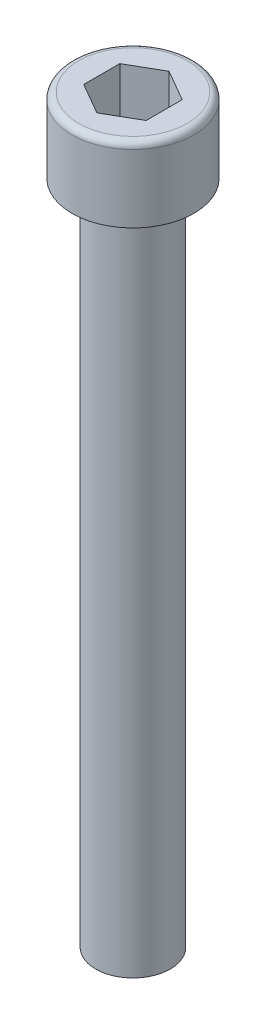
ISO-10303-21;
HEADER;
FILE_DESCRIPTION(('STEP AP214'),'2;1');
FILE_NAME('part.step','',(''),(''),'','','');
FILE_SCHEMA(('AUTOMOTIVE_DESIGN { 1 0 10303 214 1 1 1 1 }'));
ENDSEC;
DATA;
#1=APPLICATION_CONTEXT('core data for automotive mechanical design processes');
#2=APPLICATION_PROTOCOL_DEFINITION('international standard','automotive_design',2000,#1);
#3=PRODUCT_CONTEXT('',#1,'mechanical');
#4=PRODUCT('Part','Part','',(#3));
#5=PRODUCT_RELATED_PRODUCT_CATEGORY('part','',(#4));
#6=PRODUCT_DEFINITION_FORMATION('','',#4);
#7=PRODUCT_DEFINITION_CONTEXT('part definition',#1,'design');
#8=PRODUCT_DEFINITION('design','',#6,#7);
#9=PRODUCT_DEFINITION_SHAPE('','',#8);
#10=(LENGTH_UNIT() NAMED_UNIT(*) SI_UNIT(.MILLI.,.METRE.));
#11=(NAMED_UNIT(*) PLANE_ANGLE_UNIT() SI_UNIT($,.RADIAN.));
#12=(NAMED_UNIT(*) SI_UNIT($,.STERADIAN.) SOLID_ANGLE_UNIT());
#13=UNCERTAINTY_MEASURE_WITH_UNIT(LENGTH_MEASURE(1.E-05),#10,'distance_accuracy_value','');
#14=(GEOMETRIC_REPRESENTATION_CONTEXT(3) GLOBAL_UNCERTAINTY_ASSIGNED_CONTEXT((#13)) GLOBAL_UNIT_ASSIGNED_CONTEXT((#10,
#11,#12)) REPRESENTATION_CONTEXT('',''));
#15=CARTESIAN_POINT('',(0.,0.,0.));
#16=DIRECTION('',(0.,0.,1.));
#17=DIRECTION('',(1.,0.,0.));
#18=AXIS2_PLACEMENT_3D('',#15,#16,#17);
#19=CARTESIAN_POINT('',(0.,-25.4,0.));
#20=DIRECTION('',(0.,1.,0.));
#21=DIRECTION('',(0.,0.,1.));
#22=AXIS2_PLACEMENT_3D('',#19,#20,#21);
#23=CYLINDRICAL_SURFACE('',#22,1.4224);
#24=CARTESIAN_POINT('',(0.,-25.4,0.));
#25=DIRECTION('',(0.,1.,0.));
#26=DIRECTION('',(0.,0.,1.));
#27=AXIS2_PLACEMENT_3D('',#24,#25,#26);
#28=CIRCLE('',#27,1.4224);
#29=CARTESIAN_POINT('',(0.,-25.4,1.4224));
#30=VERTEX_POINT('',#29);
#31=EDGE_CURVE('E145',#30,#30,#28,.T.);
#32=ORIENTED_EDGE('',*,*,#31,.T.);
#33=EDGE_LOOP('',(#32));
#34=FACE_BOUND('',#33,.T.);
#35=CARTESIAN_POINT('',(0.,0.,0.));
#36=DIRECTION('',(0.,1.,0.));
#37=DIRECTION('',(0.,0.,1.));
#38=AXIS2_PLACEMENT_3D('',#35,#36,#37);
#39=CIRCLE('',#38,1.4224);
#40=CARTESIAN_POINT('',(0.,0.,1.4224));
#41=VERTEX_POINT('',#40);
#42=EDGE_CURVE('E144',#41,#41,#39,.T.);
#43=ORIENTED_EDGE('',*,*,#42,.F.);
#44=EDGE_LOOP('',(#43));
#45=FACE_BOUND('',#44,.T.);
#46=ADVANCED_FACE('F34',(#34,#45),#23,.T.);
#47=CARTESIAN_POINT('',(0.,-25.4,0.));
#48=DIRECTION('',(0.,1.,0.));
#49=DIRECTION('',(0.,0.,1.));
#50=AXIS2_PLACEMENT_3D('',#47,#48,#49);
#51=PLANE('',#50);
#52=ORIENTED_EDGE('',*,*,#31,.F.);
#53=EDGE_LOOP('',(#52));
#54=FACE_BOUND('',#53,.T.);
#55=ADVANCED_FACE('F168',(#54),#51,.F.);
#56=CARTESIAN_POINT('',(0.,2.8448,0.));
#57=DIRECTION('',(0.,-1.,0.));
#58=DIRECTION('',(0.,0.,-1.));
#59=AXIS2_PLACEMENT_3D('',#56,#57,#58);
#60=CYLINDRICAL_SURFACE('',#59,2.3241);
#61=CARTESIAN_POINT('',(0.,2.5908,0.));
#62=DIRECTION('',(0.,1.,0.));
#63=DIRECTION('',(0.,0.,1.));
#64=AXIS2_PLACEMENT_3D('',#61,#62,#63);
#65=CIRCLE('',#64,2.3241);
#66=CARTESIAN_POINT('',(0.,2.5908,2.3241));
#67=VERTEX_POINT('',#66);
#68=EDGE_CURVE('E11',#67,#67,#65,.F.);
#69=ORIENTED_EDGE('',*,*,#68,.T.);
#70=EDGE_LOOP('',(#69));
#71=FACE_BOUND('',#70,.T.);
#72=CARTESIAN_POINT('',(0.,0.,0.));
#73=DIRECTION('',(0.,1.,0.));
#74=DIRECTION('',(0.,0.,1.));
#75=AXIS2_PLACEMENT_3D('',#72,#73,#74);
#76=CIRCLE('',#75,2.3241);
#77=CARTESIAN_POINT('',(0.,0.,2.3241));
#78=VERTEX_POINT('',#77);
#79=EDGE_CURVE('E136',#78,#78,#76,.T.);
#80=ORIENTED_EDGE('',*,*,#79,.T.);
#81=EDGE_LOOP('',(#80));
#82=FACE_BOUND('',#81,.T.);
#83=ADVANCED_FACE('F173',(#71,#82),#60,.T.);
#84=CARTESIAN_POINT('',(0.,2.8448,0.));
#85=DIRECTION('',(0.,1.,0.));
#86=DIRECTION('',(0.,0.,1.));
#87=AXIS2_PLACEMENT_3D('',#84,#85,#86);
#88=PLANE('',#87);
#89=DIRECTION('',(-0.866025403784439,0.,-0.5));
#90=VECTOR('',#89,1.);
#91=CARTESIAN_POINT('',(1.190625,2.8448,-0.687407664253899));
#92=LINE('',#91,#90);
#93=CARTESIAN_POINT('',(1.190625,2.8448,-0.687407664253899));
#94=VERTEX_POINT('',#93);
#95=CARTESIAN_POINT('',(0.,2.8448,-1.3748153285078));
#96=VERTEX_POINT('',#95);
#97=EDGE_CURVE('E49',#94,#96,#92,.T.);
#98=ORIENTED_EDGE('',*,*,#97,.F.);
#99=DIRECTION('',(0.,0.,-1.));
#100=VECTOR('',#99,1.);
#101=CARTESIAN_POINT('',(1.190625,2.8448,0.687407664253899));
#102=LINE('',#101,#100);
#103=CARTESIAN_POINT('',(1.190625,2.8448,0.687407664253899));
#104=VERTEX_POINT('',#103);
#105=EDGE_CURVE('E132',#104,#94,#102,.T.);
#106=ORIENTED_EDGE('',*,*,#105,.F.);
#107=DIRECTION('',(0.866025403784439,0.,-0.5));
#108=VECTOR('',#107,1.);
#109=CARTESIAN_POINT('',(0.,2.8448,1.3748153285078));
#110=LINE('',#109,#108);
#111=CARTESIAN_POINT('',(0.,2.8448,1.3748153285078));
#112=VERTEX_POINT('',#111);
#113=EDGE_CURVE('E130',#112,#104,#110,.T.);
#114=ORIENTED_EDGE('',*,*,#113,.F.);
#115=DIRECTION('',(0.866025403784439,0.,0.5));
#116=VECTOR('',#115,1.);
#117=CARTESIAN_POINT('',(-1.190625,2.8448,0.687407664253898));
#118=LINE('',#117,#116);
#119=CARTESIAN_POINT('',(-1.190625,2.8448,0.687407664253898));
#120=VERTEX_POINT('',#119);
#121=EDGE_CURVE('E97',#120,#112,#118,.T.);
#122=ORIENTED_EDGE('',*,*,#121,.F.);
#123=DIRECTION('',(0.,0.,1.));
#124=VECTOR('',#123,1.);
#125=CARTESIAN_POINT('',(-1.190625,2.8448,-0.687407664253899));
#126=LINE('',#125,#124);
#127=CARTESIAN_POINT('',(-1.190625,2.8448,-0.687407664253899));
#128=VERTEX_POINT('',#127);
#129=EDGE_CURVE('E126',#128,#120,#126,.T.);
#130=ORIENTED_EDGE('',*,*,#129,.F.);
#131=DIRECTION('',(-0.866025403784439,0.,0.5));
#132=VECTOR('',#131,1.);
#133=CARTESIAN_POINT('',(0.,2.8448,-1.3748153285078));
#134=LINE('',#133,#132);
#135=EDGE_CURVE('E123',#96,#128,#134,.T.);
#136=ORIENTED_EDGE('',*,*,#135,.F.);
#137=EDGE_LOOP('',(#98,#106,#114,#122,#130,#136));
#138=FACE_BOUND('',#137,.T.);
#139=CARTESIAN_POINT('',(0.,2.8448,0.));
#140=DIRECTION('',(0.,1.,0.));
#141=DIRECTION('',(0.,0.,1.));
#142=AXIS2_PLACEMENT_3D('',#139,#140,#141);
#143=CIRCLE('',#142,2.0701);
#144=CARTESIAN_POINT('',(0.,2.8448,2.0701));
#145=VERTEX_POINT('',#144);
#146=EDGE_CURVE('E42',#145,#145,#143,.T.);
#147=ORIENTED_EDGE('',*,*,#146,.T.);
#148=EDGE_LOOP('',(#147));
#149=FACE_BOUND('',#148,.T.);
#150=ADVANCED_FACE('F152',(#138,#149),#88,.T.);
#151=CARTESIAN_POINT('',(0.,0.,0.));
#152=DIRECTION('',(0.,1.,0.));
#153=DIRECTION('',(0.,0.,1.));
#154=AXIS2_PLACEMENT_3D('',#151,#152,#153);
#155=PLANE('',#154);
#156=ORIENTED_EDGE('',*,*,#42,.T.);
#157=EDGE_LOOP('',(#156));
#158=FACE_BOUND('',#157,.T.);
#159=ORIENTED_EDGE('',*,*,#79,.F.);
#160=EDGE_LOOP('',(#159));
#161=FACE_BOUND('',#160,.T.);
#162=ADVANCED_FACE('F156',(#158,#161),#155,.F.);
#163=CARTESIAN_POINT('',(0.,2.5908,0.));
#164=DIRECTION('',(0.,1.,0.));
#165=DIRECTION('',(0.,0.,1.));
#166=AXIS2_PLACEMENT_3D('',#163,#164,#165);
#167=TOROIDAL_SURFACE('',#166,2.0701,0.254);
#168=ORIENTED_EDGE('',*,*,#68,.F.);
#169=EDGE_LOOP('',(#168));
#170=FACE_BOUND('',#169,.T.);
#171=ORIENTED_EDGE('',*,*,#146,.F.);
#172=EDGE_LOOP('',(#171));
#173=FACE_BOUND('',#172,.T.);
#174=ADVANCED_FACE('F36',(#170,#173),#167,.T.);
#175=CARTESIAN_POINT('',(1.190625,0.9398,-0.687407664253899));
#176=DIRECTION('',(0.5,0.,-0.866025403784439));
#177=DIRECTION('',(-0.866025403784439,0.,-0.5));
#178=AXIS2_PLACEMENT_3D('',#175,#176,#177);
#179=PLANE('',#178);
#180=ORIENTED_EDGE('',*,*,#97,.T.);
#181=DIRECTION('',(0.,1.,0.));
#182=VECTOR('',#181,1.);
#183=CARTESIAN_POINT('',(0.,0.9398,-1.3748153285078));
#184=LINE('',#183,#182);
#185=CARTESIAN_POINT('',(0.,0.9398,-1.3748153285078));
#186=VERTEX_POINT('',#185);
#187=EDGE_CURVE('E79',#186,#96,#184,.T.);
#188=ORIENTED_EDGE('',*,*,#187,.F.);
#189=DIRECTION('',(-0.866025403784439,0.,-0.5));
#190=VECTOR('',#189,1.);
#191=CARTESIAN_POINT('',(1.190625,0.9398,-0.687407664253899));
#192=LINE('',#191,#190);
#193=CARTESIAN_POINT('',(1.190625,0.9398,-0.687407664253899));
#194=VERTEX_POINT('',#193);
#195=EDGE_CURVE('E134',#194,#186,#192,.T.);
#196=ORIENTED_EDGE('',*,*,#195,.F.);
#197=DIRECTION('',(0.,1.,0.));
#198=VECTOR('',#197,1.);
#199=CARTESIAN_POINT('',(1.190625,0.9398,-0.687407664253899));
#200=LINE('',#199,#198);
#201=EDGE_CURVE('E57',#194,#94,#200,.T.);
#202=ORIENTED_EDGE('',*,*,#201,.T.);
#203=EDGE_LOOP('',(#180,#188,#196,#202));
#204=FACE_BOUND('',#203,.T.);
#205=ADVANCED_FACE('F155',(#204),#179,.F.);
#206=CARTESIAN_POINT('',(1.190625,0.9398,0.687407664253899));
#207=DIRECTION('',(1.,0.,0.));
#208=DIRECTION('',(0.,0.,-1.));
#209=AXIS2_PLACEMENT_3D('',#206,#207,#208);
#210=PLANE('',#209);
#211=ORIENTED_EDGE('',*,*,#105,.T.);
#212=ORIENTED_EDGE('',*,*,#201,.F.);
#213=DIRECTION('',(0.,0.,-1.));
#214=VECTOR('',#213,1.);
#215=CARTESIAN_POINT('',(1.190625,0.9398,0.687407664253899));
#216=LINE('',#215,#214);
#217=CARTESIAN_POINT('',(1.190625,0.9398,0.687407664253899));
#218=VERTEX_POINT('',#217);
#219=EDGE_CURVE('E109',#218,#194,#216,.T.);
#220=ORIENTED_EDGE('',*,*,#219,.F.);
#221=DIRECTION('',(0.,1.,0.));
#222=VECTOR('',#221,1.);
#223=CARTESIAN_POINT('',(1.190625,0.9398,0.687407664253899));
#224=LINE('',#223,#222);
#225=EDGE_CURVE('E101',#218,#104,#224,.T.);
#226=ORIENTED_EDGE('',*,*,#225,.T.);
#227=EDGE_LOOP('',(#211,#212,#220,#226));
#228=FACE_BOUND('',#227,.T.);
#229=ADVANCED_FACE('F162',(#228),#210,.F.);
#230=CARTESIAN_POINT('',(0.,0.9398,1.3748153285078));
#231=DIRECTION('',(0.5,0.,0.866025403784439));
#232=DIRECTION('',(0.866025403784439,0.,-0.5));
#233=AXIS2_PLACEMENT_3D('',#230,#231,#232);
#234=PLANE('',#233);
#235=ORIENTED_EDGE('',*,*,#113,.T.);
#236=ORIENTED_EDGE('',*,*,#225,.F.);
#237=DIRECTION('',(0.866025403784439,0.,-0.5));
#238=VECTOR('',#237,1.);
#239=CARTESIAN_POINT('',(0.,0.9398,1.3748153285078));
#240=LINE('',#239,#238);
#241=CARTESIAN_POINT('',(0.,0.9398,1.3748153285078));
#242=VERTEX_POINT('',#241);
#243=EDGE_CURVE('E105',#242,#218,#240,.T.);
#244=ORIENTED_EDGE('',*,*,#243,.F.);
#245=DIRECTION('',(0.,1.,0.));
#246=VECTOR('',#245,1.);
#247=CARTESIAN_POINT('',(0.,0.9398,1.3748153285078));
#248=LINE('',#247,#246);
#249=EDGE_CURVE('E90',#242,#112,#248,.T.);
#250=ORIENTED_EDGE('',*,*,#249,.T.);
#251=EDGE_LOOP('',(#235,#236,#244,#250));
#252=FACE_BOUND('',#251,.T.);
#253=ADVANCED_FACE('F106',(#252),#234,.F.);
#254=CARTESIAN_POINT('',(-1.190625,0.9398,0.687407664253898));
#255=DIRECTION('',(-0.5,0.,0.866025403784439));
#256=DIRECTION('',(0.866025403784439,0.,0.5));
#257=AXIS2_PLACEMENT_3D('',#254,#255,#256);
#258=PLANE('',#257);
#259=ORIENTED_EDGE('',*,*,#121,.T.);
#260=ORIENTED_EDGE('',*,*,#249,.F.);
#261=DIRECTION('',(0.866025403784439,0.,0.5));
#262=VECTOR('',#261,1.);
#263=CARTESIAN_POINT('',(-1.190625,0.9398,0.687407664253898));
#264=LINE('',#263,#262);
#265=CARTESIAN_POINT('',(-1.190625,0.9398,0.687407664253898));
#266=VERTEX_POINT('',#265);
#267=EDGE_CURVE('E94',#266,#242,#264,.T.);
#268=ORIENTED_EDGE('',*,*,#267,.F.);
#269=DIRECTION('',(0.,1.,0.));
#270=VECTOR('',#269,1.);
#271=CARTESIAN_POINT('',(-1.190625,0.9398,0.687407664253898));
#272=LINE('',#271,#270);
#273=EDGE_CURVE('E102',#266,#120,#272,.T.);
#274=ORIENTED_EDGE('',*,*,#273,.T.);
#275=EDGE_LOOP('',(#259,#260,#268,#274));
#276=FACE_BOUND('',#275,.T.);
#277=ADVANCED_FACE('F92',(#276),#258,.F.);
#278=CARTESIAN_POINT('',(-1.190625,0.9398,-0.687407664253899));
#279=DIRECTION('',(-1.,0.,0.));
#280=DIRECTION('',(0.,0.,1.));
#281=AXIS2_PLACEMENT_3D('',#278,#279,#280);
#282=PLANE('',#281);
#283=ORIENTED_EDGE('',*,*,#129,.T.);
#284=ORIENTED_EDGE('',*,*,#273,.F.);
#285=DIRECTION('',(0.,0.,1.));
#286=VECTOR('',#285,1.);
#287=CARTESIAN_POINT('',(-1.190625,0.9398,-0.687407664253899));
#288=LINE('',#287,#286);
#289=CARTESIAN_POINT('',(-1.190625,0.9398,-0.687407664253899));
#290=VERTEX_POINT('',#289);
#291=EDGE_CURVE('E115',#290,#266,#288,.T.);
#292=ORIENTED_EDGE('',*,*,#291,.F.);
#293=DIRECTION('',(0.,1.,0.));
#294=VECTOR('',#293,1.);
#295=CARTESIAN_POINT('',(-1.190625,0.9398,-0.687407664253899));
#296=LINE('',#295,#294);
#297=EDGE_CURVE('E139',#290,#128,#296,.T.);
#298=ORIENTED_EDGE('',*,*,#297,.T.);
#299=EDGE_LOOP('',(#283,#284,#292,#298));
#300=FACE_BOUND('',#299,.T.);
#301=ADVANCED_FACE('F187',(#300),#282,.F.);
#302=CARTESIAN_POINT('',(0.,0.9398,-1.3748153285078));
#303=DIRECTION('',(-0.5,0.,-0.866025403784439));
#304=DIRECTION('',(-0.866025403784439,0.,0.5));
#305=AXIS2_PLACEMENT_3D('',#302,#303,#304);
#306=PLANE('',#305);
#307=ORIENTED_EDGE('',*,*,#135,.T.);
#308=ORIENTED_EDGE('',*,*,#297,.F.);
#309=DIRECTION('',(-0.866025403784439,0.,0.5));
#310=VECTOR('',#309,1.);
#311=CARTESIAN_POINT('',(0.,0.9398,-1.3748153285078));
#312=LINE('',#311,#310);
#313=EDGE_CURVE('E117',#186,#290,#312,.T.);
#314=ORIENTED_EDGE('',*,*,#313,.F.);
#315=ORIENTED_EDGE('',*,*,#187,.T.);
#316=EDGE_LOOP('',(#307,#308,#314,#315));
#317=FACE_BOUND('',#316,.T.);
#318=ADVANCED_FACE('F184',(#317),#306,.F.);
#319=CARTESIAN_POINT('',(0.,0.9398,0.));
#320=DIRECTION('',(0.,1.,0.));
#321=DIRECTION('',(0.,0.,1.));
#322=AXIS2_PLACEMENT_3D('',#319,#320,#321);
#323=PLANE('',#322);
#324=ORIENTED_EDGE('',*,*,#195,.T.);
#325=ORIENTED_EDGE('',*,*,#313,.T.);
#326=ORIENTED_EDGE('',*,*,#291,.T.);
#327=ORIENTED_EDGE('',*,*,#267,.T.);
#328=ORIENTED_EDGE('',*,*,#243,.T.);
#329=ORIENTED_EDGE('',*,*,#219,.T.);
#330=EDGE_LOOP('',(#324,#325,#326,#327,#328,#329));
#331=FACE_BOUND('',#330,.T.);
#332=ADVANCED_FACE('F112',(#331),#323,.T.);
#333=CLOSED_SHELL('',(#46,#55,#83,#150,#162,#174,#205,#229,#253,#277,#301,#318,#332));
#334=MANIFOLD_SOLID_BREP('B2',#333);
#335=ADVANCED_BREP_SHAPE_REPRESENTATION('',(#18,#334),#14);
#336=SHAPE_DEFINITION_REPRESENTATION(#9,#335);
ENDSEC;
END-ISO-10303-21;
